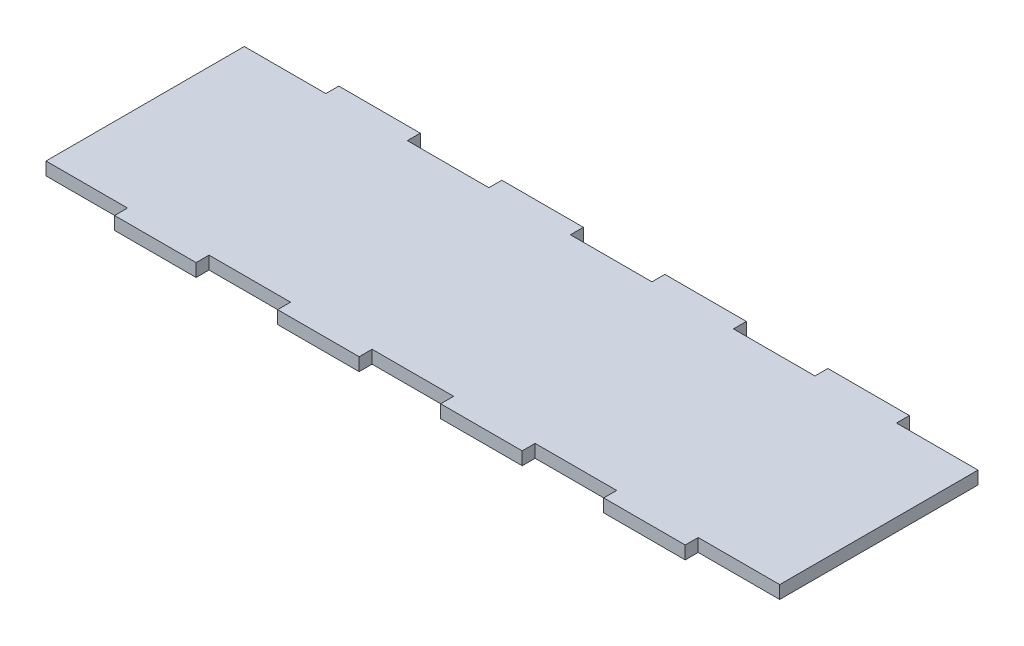
ISO-10303-21;
HEADER;
FILE_DESCRIPTION(('STEP AP214'),'2;1');
FILE_NAME('part.step','',(''),(''),'','','');
FILE_SCHEMA(('AUTOMOTIVE_DESIGN { 1 0 10303 214 1 1 1 1 }'));
ENDSEC;
DATA;
#1=APPLICATION_CONTEXT('core data for automotive mechanical design processes');
#2=APPLICATION_PROTOCOL_DEFINITION('international standard','automotive_design',2000,#1);
#3=PRODUCT_CONTEXT('',#1,'mechanical');
#4=PRODUCT('Part','Part','',(#3));
#5=PRODUCT_RELATED_PRODUCT_CATEGORY('part','',(#4));
#6=PRODUCT_DEFINITION_FORMATION('','',#4);
#7=PRODUCT_DEFINITION_CONTEXT('part definition',#1,'design');
#8=PRODUCT_DEFINITION('design','',#6,#7);
#9=PRODUCT_DEFINITION_SHAPE('','',#8);
#10=(LENGTH_UNIT() NAMED_UNIT(*) SI_UNIT(.MILLI.,.METRE.));
#11=(NAMED_UNIT(*) PLANE_ANGLE_UNIT() SI_UNIT($,.RADIAN.));
#12=(NAMED_UNIT(*) SI_UNIT($,.STERADIAN.) SOLID_ANGLE_UNIT());
#13=UNCERTAINTY_MEASURE_WITH_UNIT(LENGTH_MEASURE(1.E-05),#10,'distance_accuracy_value','');
#14=(GEOMETRIC_REPRESENTATION_CONTEXT(3) GLOBAL_UNCERTAINTY_ASSIGNED_CONTEXT((#13)) GLOBAL_UNIT_ASSIGNED_CONTEXT((#10,
#11,#12)) REPRESENTATION_CONTEXT('',''));
#15=CARTESIAN_POINT('',(0.,0.,0.));
#16=DIRECTION('',(0.,0.,1.));
#17=DIRECTION('',(1.,0.,0.));
#18=AXIS2_PLACEMENT_3D('',#15,#16,#17);
#19=CARTESIAN_POINT('',(1.11022302462516E-13,3.175,48.65));
#20=DIRECTION('',(1.,0.,0.));
#21=DIRECTION('',(0.,0.,-1.));
#22=AXIS2_PLACEMENT_3D('',#19,#20,#21);
#23=PLANE('',#22);
#24=DIRECTION('',(0.,0.,1.));
#25=VECTOR('',#24,1.);
#26=CARTESIAN_POINT('',(1.11022302462516E-13,0.,48.65));
#27=LINE('',#26,#25);
#28=CARTESIAN_POINT('',(0.,0.,0.));
#29=VERTEX_POINT('',#28);
#30=CARTESIAN_POINT('',(1.11022302462516E-13,0.,48.65));
#31=VERTEX_POINT('',#30);
#32=EDGE_CURVE('E297',#29,#31,#27,.T.);
#33=ORIENTED_EDGE('',*,*,#32,.T.);
#34=DIRECTION('',(0.,-1.,0.));
#35=VECTOR('',#34,1.);
#36=CARTESIAN_POINT('',(1.11022302462516E-13,3.175,48.65));
#37=LINE('',#36,#35);
#38=CARTESIAN_POINT('',(1.11022302462516E-13,3.175,48.65));
#39=VERTEX_POINT('',#38);
#40=EDGE_CURVE('E11',#39,#31,#37,.T.);
#41=ORIENTED_EDGE('',*,*,#40,.F.);
#42=DIRECTION('',(0.,0.,1.));
#43=VECTOR('',#42,1.);
#44=CARTESIAN_POINT('',(1.11022302462516E-13,3.175,48.65));
#45=LINE('',#44,#43);
#46=CARTESIAN_POINT('',(0.,3.175,0.));
#47=VERTEX_POINT('',#46);
#48=EDGE_CURVE('E367',#47,#39,#45,.T.);
#49=ORIENTED_EDGE('',*,*,#48,.F.);
#50=DIRECTION('',(0.,-1.,0.));
#51=VECTOR('',#50,1.);
#52=CARTESIAN_POINT('',(0.,3.175,0.));
#53=LINE('',#52,#51);
#54=EDGE_CURVE('E293',#47,#29,#53,.T.);
#55=ORIENTED_EDGE('',*,*,#54,.T.);
#56=EDGE_LOOP('',(#33,#41,#49,#55));
#57=FACE_BOUND('',#56,.T.);
#58=ADVANCED_FACE('F33',(#57),#23,.F.);
#59=CARTESIAN_POINT('',(1.11022302462516E-13,3.175,48.65));
#60=DIRECTION('',(0.,0.,-1.));
#61=DIRECTION('',(-1.,0.,0.));
#62=AXIS2_PLACEMENT_3D('',#59,#60,#61);
#63=PLANE('',#62);
#64=DIRECTION('',(1.,0.,0.));
#65=VECTOR('',#64,1.);
#66=CARTESIAN_POINT('',(1.11022302462516E-13,0.,48.65));
#67=LINE('',#66,#65);
#68=CARTESIAN_POINT('',(20.0000000000001,0.,48.65));
#69=VERTEX_POINT('',#68);
#70=EDGE_CURVE('E300',#31,#69,#67,.T.);
#71=ORIENTED_EDGE('',*,*,#70,.T.);
#72=DIRECTION('',(0.,-1.,0.));
#73=VECTOR('',#72,1.);
#74=CARTESIAN_POINT('',(20.0000000000001,3.175,48.65));
#75=LINE('',#74,#73);
#76=CARTESIAN_POINT('',(20.0000000000001,3.175,48.65));
#77=VERTEX_POINT('',#76);
#78=EDGE_CURVE('E41',#77,#69,#75,.T.);
#79=ORIENTED_EDGE('',*,*,#78,.F.);
#80=DIRECTION('',(1.,0.,0.));
#81=VECTOR('',#80,1.);
#82=CARTESIAN_POINT('',(1.11022302462516E-13,3.175,48.65));
#83=LINE('',#82,#81);
#84=EDGE_CURVE('E176',#39,#77,#83,.T.);
#85=ORIENTED_EDGE('',*,*,#84,.F.);
#86=ORIENTED_EDGE('',*,*,#40,.T.);
#87=EDGE_LOOP('',(#71,#79,#85,#86));
#88=FACE_BOUND('',#87,.T.);
#89=ADVANCED_FACE('F565',(#88),#63,.F.);
#90=CARTESIAN_POINT('',(20.0000000000001,3.175,48.65));
#91=DIRECTION('',(1.,0.,0.));
#92=DIRECTION('',(0.,0.,-1.));
#93=AXIS2_PLACEMENT_3D('',#90,#91,#92);
#94=PLANE('',#93);
#95=DIRECTION('',(0.,0.,1.));
#96=VECTOR('',#95,1.);
#97=CARTESIAN_POINT('',(20.0000000000001,0.,48.65));
#98=LINE('',#97,#96);
#99=CARTESIAN_POINT('',(20.0000000000001,0.,51.825));
#100=VERTEX_POINT('',#99);
#101=EDGE_CURVE('E302',#69,#100,#98,.T.);
#102=ORIENTED_EDGE('',*,*,#101,.T.);
#103=DIRECTION('',(0.,-1.,0.));
#104=VECTOR('',#103,1.);
#105=CARTESIAN_POINT('',(20.0000000000001,3.175,51.825));
#106=LINE('',#105,#104);
#107=CARTESIAN_POINT('',(20.0000000000001,3.175,51.825));
#108=VERTEX_POINT('',#107);
#109=EDGE_CURVE('E458',#108,#100,#106,.T.);
#110=ORIENTED_EDGE('',*,*,#109,.F.);
#111=DIRECTION('',(0.,0.,1.));
#112=VECTOR('',#111,1.);
#113=CARTESIAN_POINT('',(20.0000000000001,3.175,48.65));
#114=LINE('',#113,#112);
#115=EDGE_CURVE('E466',#77,#108,#114,.T.);
#116=ORIENTED_EDGE('',*,*,#115,.F.);
#117=ORIENTED_EDGE('',*,*,#78,.T.);
#118=EDGE_LOOP('',(#102,#110,#116,#117));
#119=FACE_BOUND('',#118,.T.);
#120=ADVANCED_FACE('F464',(#119),#94,.F.);
#121=CARTESIAN_POINT('',(20.0000000000001,3.175,51.825));
#122=DIRECTION('',(0.,0.,-1.));
#123=DIRECTION('',(-1.,0.,0.));
#124=AXIS2_PLACEMENT_3D('',#121,#122,#123);
#125=PLANE('',#124);
#126=DIRECTION('',(1.,0.,0.));
#127=VECTOR('',#126,1.);
#128=CARTESIAN_POINT('',(20.0000000000001,0.,51.825));
#129=LINE('',#128,#127);
#130=CARTESIAN_POINT('',(40.0000000000001,0.,51.825));
#131=VERTEX_POINT('',#130);
#132=EDGE_CURVE('E304',#100,#131,#129,.T.);
#133=ORIENTED_EDGE('',*,*,#132,.T.);
#134=DIRECTION('',(0.,-1.,0.));
#135=VECTOR('',#134,1.);
#136=CARTESIAN_POINT('',(40.0000000000001,3.175,51.825));
#137=LINE('',#136,#135);
#138=CARTESIAN_POINT('',(40.0000000000001,3.175,51.825));
#139=VERTEX_POINT('',#138);
#140=EDGE_CURVE('E455',#139,#131,#137,.T.);
#141=ORIENTED_EDGE('',*,*,#140,.F.);
#142=DIRECTION('',(1.,0.,0.));
#143=VECTOR('',#142,1.);
#144=CARTESIAN_POINT('',(20.0000000000001,3.175,51.825));
#145=LINE('',#144,#143);
#146=EDGE_CURVE('E484',#108,#139,#145,.T.);
#147=ORIENTED_EDGE('',*,*,#146,.F.);
#148=ORIENTED_EDGE('',*,*,#109,.T.);
#149=EDGE_LOOP('',(#133,#141,#147,#148));
#150=FACE_BOUND('',#149,.T.);
#151=ADVANCED_FACE('F475',(#150),#125,.F.);
#152=CARTESIAN_POINT('',(40.0000000000001,3.175,51.825));
#153=DIRECTION('',(-1.,0.,0.));
#154=DIRECTION('',(0.,0.,1.));
#155=AXIS2_PLACEMENT_3D('',#152,#153,#154);
#156=PLANE('',#155);
#157=DIRECTION('',(0.,0.,-1.));
#158=VECTOR('',#157,1.);
#159=CARTESIAN_POINT('',(40.0000000000001,0.,51.825));
#160=LINE('',#159,#158);
#161=CARTESIAN_POINT('',(40.0000000000001,0.,48.65));
#162=VERTEX_POINT('',#161);
#163=EDGE_CURVE('E306',#131,#162,#160,.T.);
#164=ORIENTED_EDGE('',*,*,#163,.T.);
#165=DIRECTION('',(0.,-1.,0.));
#166=VECTOR('',#165,1.);
#167=CARTESIAN_POINT('',(40.0000000000001,3.175,48.65));
#168=LINE('',#167,#166);
#169=CARTESIAN_POINT('',(40.0000000000001,3.175,48.65));
#170=VERTEX_POINT('',#169);
#171=EDGE_CURVE('E452',#170,#162,#168,.T.);
#172=ORIENTED_EDGE('',*,*,#171,.F.);
#173=DIRECTION('',(0.,0.,-1.));
#174=VECTOR('',#173,1.);
#175=CARTESIAN_POINT('',(40.0000000000001,3.175,51.825));
#176=LINE('',#175,#174);
#177=EDGE_CURVE('E481',#139,#170,#176,.T.);
#178=ORIENTED_EDGE('',*,*,#177,.F.);
#179=ORIENTED_EDGE('',*,*,#140,.T.);
#180=EDGE_LOOP('',(#164,#172,#178,#179));
#181=FACE_BOUND('',#180,.T.);
#182=ADVANCED_FACE('F479',(#181),#156,.F.);
#183=CARTESIAN_POINT('',(40.0000000000001,3.175,48.65));
#184=DIRECTION('',(0.,0.,-1.));
#185=DIRECTION('',(-1.,0.,0.));
#186=AXIS2_PLACEMENT_3D('',#183,#184,#185);
#187=PLANE('',#186);
#188=DIRECTION('',(1.,0.,0.));
#189=VECTOR('',#188,1.);
#190=CARTESIAN_POINT('',(40.0000000000001,0.,48.65));
#191=LINE('',#190,#189);
#192=CARTESIAN_POINT('',(60.0000000000001,0.,48.65));
#193=VERTEX_POINT('',#192);
#194=EDGE_CURVE('E308',#162,#193,#191,.T.);
#195=ORIENTED_EDGE('',*,*,#194,.T.);
#196=DIRECTION('',(0.,-1.,0.));
#197=VECTOR('',#196,1.);
#198=CARTESIAN_POINT('',(60.0000000000001,3.175,48.65));
#199=LINE('',#198,#197);
#200=CARTESIAN_POINT('',(60.0000000000001,3.175,48.65));
#201=VERTEX_POINT('',#200);
#202=EDGE_CURVE('E449',#201,#193,#199,.T.);
#203=ORIENTED_EDGE('',*,*,#202,.F.);
#204=DIRECTION('',(1.,0.,0.));
#205=VECTOR('',#204,1.);
#206=CARTESIAN_POINT('',(40.0000000000001,3.175,48.65));
#207=LINE('',#206,#205);
#208=EDGE_CURVE('E483',#170,#201,#207,.T.);
#209=ORIENTED_EDGE('',*,*,#208,.F.);
#210=ORIENTED_EDGE('',*,*,#171,.T.);
#211=EDGE_LOOP('',(#195,#203,#209,#210));
#212=FACE_BOUND('',#211,.T.);
#213=ADVANCED_FACE('F578',(#212),#187,.F.);
#214=CARTESIAN_POINT('',(60.0000000000001,3.175,48.65));
#215=DIRECTION('',(1.,0.,0.));
#216=DIRECTION('',(0.,0.,-1.));
#217=AXIS2_PLACEMENT_3D('',#214,#215,#216);
#218=PLANE('',#217);
#219=DIRECTION('',(0.,0.,1.));
#220=VECTOR('',#219,1.);
#221=CARTESIAN_POINT('',(60.0000000000001,0.,48.65));
#222=LINE('',#221,#220);
#223=CARTESIAN_POINT('',(60.0000000000001,0.,51.825));
#224=VERTEX_POINT('',#223);
#225=EDGE_CURVE('E310',#193,#224,#222,.T.);
#226=ORIENTED_EDGE('',*,*,#225,.T.);
#227=DIRECTION('',(0.,-1.,0.));
#228=VECTOR('',#227,1.);
#229=CARTESIAN_POINT('',(60.0000000000001,3.175,51.825));
#230=LINE('',#229,#228);
#231=CARTESIAN_POINT('',(60.0000000000001,3.175,51.825));
#232=VERTEX_POINT('',#231);
#233=EDGE_CURVE('E446',#232,#224,#230,.T.);
#234=ORIENTED_EDGE('',*,*,#233,.F.);
#235=DIRECTION('',(0.,0.,1.));
#236=VECTOR('',#235,1.);
#237=CARTESIAN_POINT('',(60.0000000000001,3.175,48.65));
#238=LINE('',#237,#236);
#239=EDGE_CURVE('E486',#201,#232,#238,.T.);
#240=ORIENTED_EDGE('',*,*,#239,.F.);
#241=ORIENTED_EDGE('',*,*,#202,.T.);
#242=EDGE_LOOP('',(#226,#234,#240,#241));
#243=FACE_BOUND('',#242,.T.);
#244=ADVANCED_FACE('F581',(#243),#218,.F.);
#245=CARTESIAN_POINT('',(60.0000000000001,3.175,51.825));
#246=DIRECTION('',(0.,0.,-1.));
#247=DIRECTION('',(-1.,0.,0.));
#248=AXIS2_PLACEMENT_3D('',#245,#246,#247);
#249=PLANE('',#248);
#250=DIRECTION('',(1.,0.,0.));
#251=VECTOR('',#250,1.);
#252=CARTESIAN_POINT('',(60.0000000000001,0.,51.825));
#253=LINE('',#252,#251);
#254=CARTESIAN_POINT('',(80.0000000000001,0.,51.825));
#255=VERTEX_POINT('',#254);
#256=EDGE_CURVE('E312',#224,#255,#253,.T.);
#257=ORIENTED_EDGE('',*,*,#256,.T.);
#258=DIRECTION('',(0.,-1.,0.));
#259=VECTOR('',#258,1.);
#260=CARTESIAN_POINT('',(80.0000000000001,3.175,51.825));
#261=LINE('',#260,#259);
#262=CARTESIAN_POINT('',(80.0000000000001,3.175,51.825));
#263=VERTEX_POINT('',#262);
#264=EDGE_CURVE('E443',#263,#255,#261,.T.);
#265=ORIENTED_EDGE('',*,*,#264,.F.);
#266=DIRECTION('',(1.,0.,0.));
#267=VECTOR('',#266,1.);
#268=CARTESIAN_POINT('',(60.0000000000001,3.175,51.825));
#269=LINE('',#268,#267);
#270=EDGE_CURVE('E492',#232,#263,#269,.T.);
#271=ORIENTED_EDGE('',*,*,#270,.F.);
#272=ORIENTED_EDGE('',*,*,#233,.T.);
#273=EDGE_LOOP('',(#257,#265,#271,#272));
#274=FACE_BOUND('',#273,.T.);
#275=ADVANCED_FACE('F585',(#274),#249,.F.);
#276=CARTESIAN_POINT('',(80.0000000000001,3.175,51.825));
#277=DIRECTION('',(-1.,0.,0.));
#278=DIRECTION('',(0.,0.,1.));
#279=AXIS2_PLACEMENT_3D('',#276,#277,#278);
#280=PLANE('',#279);
#281=DIRECTION('',(0.,0.,-1.));
#282=VECTOR('',#281,1.);
#283=CARTESIAN_POINT('',(80.0000000000001,0.,51.825));
#284=LINE('',#283,#282);
#285=CARTESIAN_POINT('',(80.0000000000001,0.,48.65));
#286=VERTEX_POINT('',#285);
#287=EDGE_CURVE('E314',#255,#286,#284,.T.);
#288=ORIENTED_EDGE('',*,*,#287,.T.);
#289=DIRECTION('',(0.,-1.,0.));
#290=VECTOR('',#289,1.);
#291=CARTESIAN_POINT('',(80.0000000000001,3.175,48.65));
#292=LINE('',#291,#290);
#293=CARTESIAN_POINT('',(80.0000000000001,3.175,48.65));
#294=VERTEX_POINT('',#293);
#295=EDGE_CURVE('E440',#294,#286,#292,.T.);
#296=ORIENTED_EDGE('',*,*,#295,.F.);
#297=DIRECTION('',(0.,0.,-1.));
#298=VECTOR('',#297,1.);
#299=CARTESIAN_POINT('',(80.0000000000001,3.175,51.825));
#300=LINE('',#299,#298);
#301=EDGE_CURVE('E494',#263,#294,#300,.T.);
#302=ORIENTED_EDGE('',*,*,#301,.F.);
#303=ORIENTED_EDGE('',*,*,#264,.T.);
#304=EDGE_LOOP('',(#288,#296,#302,#303));
#305=FACE_BOUND('',#304,.T.);
#306=ADVANCED_FACE('F589',(#305),#280,.F.);
#307=CARTESIAN_POINT('',(80.0000000000001,3.175,48.65));
#308=DIRECTION('',(0.,0.,-1.));
#309=DIRECTION('',(-1.,0.,0.));
#310=AXIS2_PLACEMENT_3D('',#307,#308,#309);
#311=PLANE('',#310);
#312=DIRECTION('',(1.,0.,0.));
#313=VECTOR('',#312,1.);
#314=CARTESIAN_POINT('',(80.0000000000001,0.,48.65));
#315=LINE('',#314,#313);
#316=CARTESIAN_POINT('',(100.,0.,48.65));
#317=VERTEX_POINT('',#316);
#318=EDGE_CURVE('E316',#286,#317,#315,.T.);
#319=ORIENTED_EDGE('',*,*,#318,.T.);
#320=DIRECTION('',(0.,-1.,0.));
#321=VECTOR('',#320,1.);
#322=CARTESIAN_POINT('',(100.,3.175,48.65));
#323=LINE('',#322,#321);
#324=CARTESIAN_POINT('',(100.,3.175,48.65));
#325=VERTEX_POINT('',#324);
#326=EDGE_CURVE('E437',#325,#317,#323,.T.);
#327=ORIENTED_EDGE('',*,*,#326,.F.);
#328=DIRECTION('',(1.,0.,0.));
#329=VECTOR('',#328,1.);
#330=CARTESIAN_POINT('',(80.0000000000001,3.175,48.65));
#331=LINE('',#330,#329);
#332=EDGE_CURVE('E496',#294,#325,#331,.T.);
#333=ORIENTED_EDGE('',*,*,#332,.F.);
#334=ORIENTED_EDGE('',*,*,#295,.T.);
#335=EDGE_LOOP('',(#319,#327,#333,#334));
#336=FACE_BOUND('',#335,.T.);
#337=ADVANCED_FACE('F593',(#336),#311,.F.);
#338=CARTESIAN_POINT('',(100.,3.175,48.65));
#339=DIRECTION('',(1.,0.,0.));
#340=DIRECTION('',(0.,0.,-1.));
#341=AXIS2_PLACEMENT_3D('',#338,#339,#340);
#342=PLANE('',#341);
#343=DIRECTION('',(0.,0.,1.));
#344=VECTOR('',#343,1.);
#345=CARTESIAN_POINT('',(100.,0.,48.65));
#346=LINE('',#345,#344);
#347=CARTESIAN_POINT('',(100.,0.,51.825));
#348=VERTEX_POINT('',#347);
#349=EDGE_CURVE('E318',#317,#348,#346,.T.);
#350=ORIENTED_EDGE('',*,*,#349,.T.);
#351=DIRECTION('',(0.,-1.,0.));
#352=VECTOR('',#351,1.);
#353=CARTESIAN_POINT('',(100.,3.175,51.825));
#354=LINE('',#353,#352);
#355=CARTESIAN_POINT('',(100.,3.175,51.825));
#356=VERTEX_POINT('',#355);
#357=EDGE_CURVE('E434',#356,#348,#354,.T.);
#358=ORIENTED_EDGE('',*,*,#357,.F.);
#359=DIRECTION('',(0.,0.,1.));
#360=VECTOR('',#359,1.);
#361=CARTESIAN_POINT('',(100.,3.175,48.65));
#362=LINE('',#361,#360);
#363=EDGE_CURVE('E498',#325,#356,#362,.T.);
#364=ORIENTED_EDGE('',*,*,#363,.F.);
#365=ORIENTED_EDGE('',*,*,#326,.T.);
#366=EDGE_LOOP('',(#350,#358,#364,#365));
#367=FACE_BOUND('',#366,.T.);
#368=ADVANCED_FACE('F597',(#367),#342,.F.);
#369=CARTESIAN_POINT('',(100.,3.175,51.825));
#370=DIRECTION('',(0.,0.,-1.));
#371=DIRECTION('',(-1.,0.,0.));
#372=AXIS2_PLACEMENT_3D('',#369,#370,#371);
#373=PLANE('',#372);
#374=DIRECTION('',(1.,0.,0.));
#375=VECTOR('',#374,1.);
#376=CARTESIAN_POINT('',(100.,0.,51.825));
#377=LINE('',#376,#375);
#378=CARTESIAN_POINT('',(120.,0.,51.825));
#379=VERTEX_POINT('',#378);
#380=EDGE_CURVE('E320',#348,#379,#377,.T.);
#381=ORIENTED_EDGE('',*,*,#380,.T.);
#382=DIRECTION('',(0.,-1.,0.));
#383=VECTOR('',#382,1.);
#384=CARTESIAN_POINT('',(120.,3.175,51.825));
#385=LINE('',#384,#383);
#386=CARTESIAN_POINT('',(120.,3.175,51.825));
#387=VERTEX_POINT('',#386);
#388=EDGE_CURVE('E431',#387,#379,#385,.T.);
#389=ORIENTED_EDGE('',*,*,#388,.F.);
#390=DIRECTION('',(1.,0.,0.));
#391=VECTOR('',#390,1.);
#392=CARTESIAN_POINT('',(100.,3.175,51.825));
#393=LINE('',#392,#391);
#394=EDGE_CURVE('E500',#356,#387,#393,.T.);
#395=ORIENTED_EDGE('',*,*,#394,.F.);
#396=ORIENTED_EDGE('',*,*,#357,.T.);
#397=EDGE_LOOP('',(#381,#389,#395,#396));
#398=FACE_BOUND('',#397,.T.);
#399=ADVANCED_FACE('F601',(#398),#373,.F.);
#400=CARTESIAN_POINT('',(120.,3.175,51.825));
#401=DIRECTION('',(-1.,0.,0.));
#402=DIRECTION('',(0.,0.,1.));
#403=AXIS2_PLACEMENT_3D('',#400,#401,#402);
#404=PLANE('',#403);
#405=DIRECTION('',(0.,0.,-1.));
#406=VECTOR('',#405,1.);
#407=CARTESIAN_POINT('',(120.,0.,51.825));
#408=LINE('',#407,#406);
#409=CARTESIAN_POINT('',(120.,0.,48.65));
#410=VERTEX_POINT('',#409);
#411=EDGE_CURVE('E322',#379,#410,#408,.T.);
#412=ORIENTED_EDGE('',*,*,#411,.T.);
#413=DIRECTION('',(0.,-1.,0.));
#414=VECTOR('',#413,1.);
#415=CARTESIAN_POINT('',(120.,3.175,48.65));
#416=LINE('',#415,#414);
#417=CARTESIAN_POINT('',(120.,3.175,48.65));
#418=VERTEX_POINT('',#417);
#419=EDGE_CURVE('E428',#418,#410,#416,.T.);
#420=ORIENTED_EDGE('',*,*,#419,.F.);
#421=DIRECTION('',(0.,0.,-1.));
#422=VECTOR('',#421,1.);
#423=CARTESIAN_POINT('',(120.,3.175,51.825));
#424=LINE('',#423,#422);
#425=EDGE_CURVE('E502',#387,#418,#424,.T.);
#426=ORIENTED_EDGE('',*,*,#425,.F.);
#427=ORIENTED_EDGE('',*,*,#388,.T.);
#428=EDGE_LOOP('',(#412,#420,#426,#427));
#429=FACE_BOUND('',#428,.T.);
#430=ADVANCED_FACE('F605',(#429),#404,.F.);
#431=CARTESIAN_POINT('',(120.,3.175,48.65));
#432=DIRECTION('',(0.,0.,-1.));
#433=DIRECTION('',(-1.,0.,0.));
#434=AXIS2_PLACEMENT_3D('',#431,#432,#433);
#435=PLANE('',#434);
#436=DIRECTION('',(1.,0.,0.));
#437=VECTOR('',#436,1.);
#438=CARTESIAN_POINT('',(120.,0.,48.65));
#439=LINE('',#438,#437);
#440=CARTESIAN_POINT('',(140.,0.,48.65));
#441=VERTEX_POINT('',#440);
#442=EDGE_CURVE('E324',#410,#441,#439,.T.);
#443=ORIENTED_EDGE('',*,*,#442,.T.);
#444=DIRECTION('',(0.,-1.,0.));
#445=VECTOR('',#444,1.);
#446=CARTESIAN_POINT('',(140.,3.175,48.65));
#447=LINE('',#446,#445);
#448=CARTESIAN_POINT('',(140.,3.175,48.65));
#449=VERTEX_POINT('',#448);
#450=EDGE_CURVE('E425',#449,#441,#447,.T.);
#451=ORIENTED_EDGE('',*,*,#450,.F.);
#452=DIRECTION('',(1.,0.,0.));
#453=VECTOR('',#452,1.);
#454=CARTESIAN_POINT('',(120.,3.175,48.65));
#455=LINE('',#454,#453);
#456=EDGE_CURVE('E504',#418,#449,#455,.T.);
#457=ORIENTED_EDGE('',*,*,#456,.F.);
#458=ORIENTED_EDGE('',*,*,#419,.T.);
#459=EDGE_LOOP('',(#443,#451,#457,#458));
#460=FACE_BOUND('',#459,.T.);
#461=ADVANCED_FACE('F609',(#460),#435,.F.);
#462=CARTESIAN_POINT('',(140.,3.175,48.65));
#463=DIRECTION('',(1.,0.,0.));
#464=DIRECTION('',(0.,0.,-1.));
#465=AXIS2_PLACEMENT_3D('',#462,#463,#464);
#466=PLANE('',#465);
#467=DIRECTION('',(0.,0.,1.));
#468=VECTOR('',#467,1.);
#469=CARTESIAN_POINT('',(140.,0.,48.65));
#470=LINE('',#469,#468);
#471=CARTESIAN_POINT('',(140.,0.,51.825));
#472=VERTEX_POINT('',#471);
#473=EDGE_CURVE('E326',#441,#472,#470,.T.);
#474=ORIENTED_EDGE('',*,*,#473,.T.);
#475=DIRECTION('',(0.,-1.,0.));
#476=VECTOR('',#475,1.);
#477=CARTESIAN_POINT('',(140.,3.175,51.825));
#478=LINE('',#477,#476);
#479=CARTESIAN_POINT('',(140.,3.175,51.825));
#480=VERTEX_POINT('',#479);
#481=EDGE_CURVE('E422',#480,#472,#478,.T.);
#482=ORIENTED_EDGE('',*,*,#481,.F.);
#483=DIRECTION('',(0.,0.,1.));
#484=VECTOR('',#483,1.);
#485=CARTESIAN_POINT('',(140.,3.175,48.65));
#486=LINE('',#485,#484);
#487=EDGE_CURVE('E506',#449,#480,#486,.T.);
#488=ORIENTED_EDGE('',*,*,#487,.F.);
#489=ORIENTED_EDGE('',*,*,#450,.T.);
#490=EDGE_LOOP('',(#474,#482,#488,#489));
#491=FACE_BOUND('',#490,.T.);
#492=ADVANCED_FACE('F613',(#491),#466,.F.);
#493=CARTESIAN_POINT('',(140.,3.175,51.825));
#494=DIRECTION('',(0.,0.,-1.));
#495=DIRECTION('',(-1.,0.,0.));
#496=AXIS2_PLACEMENT_3D('',#493,#494,#495);
#497=PLANE('',#496);
#498=DIRECTION('',(1.,0.,0.));
#499=VECTOR('',#498,1.);
#500=CARTESIAN_POINT('',(140.,0.,51.825));
#501=LINE('',#500,#499);
#502=CARTESIAN_POINT('',(160.,0.,51.825));
#503=VERTEX_POINT('',#502);
#504=EDGE_CURVE('E328',#472,#503,#501,.T.);
#505=ORIENTED_EDGE('',*,*,#504,.T.);
#506=DIRECTION('',(0.,-1.,0.));
#507=VECTOR('',#506,1.);
#508=CARTESIAN_POINT('',(160.,3.175,51.825));
#509=LINE('',#508,#507);
#510=CARTESIAN_POINT('',(160.,3.175,51.825));
#511=VERTEX_POINT('',#510);
#512=EDGE_CURVE('E419',#511,#503,#509,.T.);
#513=ORIENTED_EDGE('',*,*,#512,.F.);
#514=DIRECTION('',(1.,0.,0.));
#515=VECTOR('',#514,1.);
#516=CARTESIAN_POINT('',(140.,3.175,51.825));
#517=LINE('',#516,#515);
#518=EDGE_CURVE('E508',#480,#511,#517,.T.);
#519=ORIENTED_EDGE('',*,*,#518,.F.);
#520=ORIENTED_EDGE('',*,*,#481,.T.);
#521=EDGE_LOOP('',(#505,#513,#519,#520));
#522=FACE_BOUND('',#521,.T.);
#523=ADVANCED_FACE('F617',(#522),#497,.F.);
#524=CARTESIAN_POINT('',(160.,3.175,51.825));
#525=DIRECTION('',(-1.,0.,0.));
#526=DIRECTION('',(0.,0.,1.));
#527=AXIS2_PLACEMENT_3D('',#524,#525,#526);
#528=PLANE('',#527);
#529=DIRECTION('',(0.,0.,-1.));
#530=VECTOR('',#529,1.);
#531=CARTESIAN_POINT('',(160.,0.,51.825));
#532=LINE('',#531,#530);
#533=CARTESIAN_POINT('',(160.,0.,48.65));
#534=VERTEX_POINT('',#533);
#535=EDGE_CURVE('E330',#503,#534,#532,.T.);
#536=ORIENTED_EDGE('',*,*,#535,.T.);
#537=DIRECTION('',(0.,-1.,0.));
#538=VECTOR('',#537,1.);
#539=CARTESIAN_POINT('',(160.,3.175,48.65));
#540=LINE('',#539,#538);
#541=CARTESIAN_POINT('',(160.,3.175,48.65));
#542=VERTEX_POINT('',#541);
#543=EDGE_CURVE('E416',#542,#534,#540,.T.);
#544=ORIENTED_EDGE('',*,*,#543,.F.);
#545=DIRECTION('',(0.,0.,-1.));
#546=VECTOR('',#545,1.);
#547=CARTESIAN_POINT('',(160.,3.175,51.825));
#548=LINE('',#547,#546);
#549=EDGE_CURVE('E510',#511,#542,#548,.T.);
#550=ORIENTED_EDGE('',*,*,#549,.F.);
#551=ORIENTED_EDGE('',*,*,#512,.T.);
#552=EDGE_LOOP('',(#536,#544,#550,#551));
#553=FACE_BOUND('',#552,.T.);
#554=ADVANCED_FACE('F621',(#553),#528,.F.);
#555=CARTESIAN_POINT('',(160.,3.175,48.65));
#556=DIRECTION('',(0.,0.,-1.));
#557=DIRECTION('',(-1.,0.,0.));
#558=AXIS2_PLACEMENT_3D('',#555,#556,#557);
#559=PLANE('',#558);
#560=DIRECTION('',(1.,0.,0.));
#561=VECTOR('',#560,1.);
#562=CARTESIAN_POINT('',(160.,0.,48.65));
#563=LINE('',#562,#561);
#564=CARTESIAN_POINT('',(180.,0.,48.65));
#565=VERTEX_POINT('',#564);
#566=EDGE_CURVE('E332',#534,#565,#563,.T.);
#567=ORIENTED_EDGE('',*,*,#566,.T.);
#568=DIRECTION('',(0.,-1.,0.));
#569=VECTOR('',#568,1.);
#570=CARTESIAN_POINT('',(180.,3.175,48.65));
#571=LINE('',#570,#569);
#572=CARTESIAN_POINT('',(180.,3.175,48.65));
#573=VERTEX_POINT('',#572);
#574=EDGE_CURVE('E413',#573,#565,#571,.T.);
#575=ORIENTED_EDGE('',*,*,#574,.F.);
#576=DIRECTION('',(1.,0.,0.));
#577=VECTOR('',#576,1.);
#578=CARTESIAN_POINT('',(160.,3.175,48.65));
#579=LINE('',#578,#577);
#580=EDGE_CURVE('E512',#542,#573,#579,.T.);
#581=ORIENTED_EDGE('',*,*,#580,.F.);
#582=ORIENTED_EDGE('',*,*,#543,.T.);
#583=EDGE_LOOP('',(#567,#575,#581,#582));
#584=FACE_BOUND('',#583,.T.);
#585=ADVANCED_FACE('F625',(#584),#559,.F.);
#586=CARTESIAN_POINT('',(180.,3.175,0.));
#587=DIRECTION('',(-1.,0.,0.));
#588=DIRECTION('',(0.,0.,1.));
#589=AXIS2_PLACEMENT_3D('',#586,#587,#588);
#590=PLANE('',#589);
#591=DIRECTION('',(0.,0.,-1.));
#592=VECTOR('',#591,1.);
#593=CARTESIAN_POINT('',(180.,0.,0.));
#594=LINE('',#593,#592);
#595=CARTESIAN_POINT('',(180.,0.,0.));
#596=VERTEX_POINT('',#595);
#597=EDGE_CURVE('E334',#565,#596,#594,.T.);
#598=ORIENTED_EDGE('',*,*,#597,.T.);
#599=DIRECTION('',(0.,-1.,0.));
#600=VECTOR('',#599,1.);
#601=CARTESIAN_POINT('',(180.,3.175,0.));
#602=LINE('',#601,#600);
#603=CARTESIAN_POINT('',(180.,3.175,0.));
#604=VERTEX_POINT('',#603);
#605=EDGE_CURVE('E410',#604,#596,#602,.T.);
#606=ORIENTED_EDGE('',*,*,#605,.F.);
#607=DIRECTION('',(0.,0.,-1.));
#608=VECTOR('',#607,1.);
#609=CARTESIAN_POINT('',(180.,3.175,0.));
#610=LINE('',#609,#608);
#611=EDGE_CURVE('E514',#573,#604,#610,.T.);
#612=ORIENTED_EDGE('',*,*,#611,.F.);
#613=ORIENTED_EDGE('',*,*,#574,.T.);
#614=EDGE_LOOP('',(#598,#606,#612,#613));
#615=FACE_BOUND('',#614,.T.);
#616=ADVANCED_FACE('F629',(#615),#590,.F.);
#617=CARTESIAN_POINT('',(160.,3.175,0.));
#618=DIRECTION('',(0.,0.,1.));
#619=DIRECTION('',(1.,0.,0.));
#620=AXIS2_PLACEMENT_3D('',#617,#618,#619);
#621=PLANE('',#620);
#622=DIRECTION('',(-1.,0.,0.));
#623=VECTOR('',#622,1.);
#624=CARTESIAN_POINT('',(160.,0.,0.));
#625=LINE('',#624,#623);
#626=CARTESIAN_POINT('',(160.,0.,0.));
#627=VERTEX_POINT('',#626);
#628=EDGE_CURVE('E336',#596,#627,#625,.T.);
#629=ORIENTED_EDGE('',*,*,#628,.T.);
#630=DIRECTION('',(0.,-1.,0.));
#631=VECTOR('',#630,1.);
#632=CARTESIAN_POINT('',(160.,3.175,0.));
#633=LINE('',#632,#631);
#634=CARTESIAN_POINT('',(160.,3.175,0.));
#635=VERTEX_POINT('',#634);
#636=EDGE_CURVE('E407',#635,#627,#633,.T.);
#637=ORIENTED_EDGE('',*,*,#636,.F.);
#638=DIRECTION('',(-1.,0.,0.));
#639=VECTOR('',#638,1.);
#640=CARTESIAN_POINT('',(160.,3.175,0.));
#641=LINE('',#640,#639);
#642=EDGE_CURVE('E516',#604,#635,#641,.T.);
#643=ORIENTED_EDGE('',*,*,#642,.F.);
#644=ORIENTED_EDGE('',*,*,#605,.T.);
#645=EDGE_LOOP('',(#629,#637,#643,#644));
#646=FACE_BOUND('',#645,.T.);
#647=ADVANCED_FACE('F633',(#646),#621,.F.);
#648=CARTESIAN_POINT('',(160.,3.175,-3.175));
#649=DIRECTION('',(-1.,0.,0.));
#650=DIRECTION('',(0.,0.,1.));
#651=AXIS2_PLACEMENT_3D('',#648,#649,#650);
#652=PLANE('',#651);
#653=DIRECTION('',(0.,0.,-1.));
#654=VECTOR('',#653,1.);
#655=CARTESIAN_POINT('',(160.,0.,-3.175));
#656=LINE('',#655,#654);
#657=CARTESIAN_POINT('',(160.,0.,-3.175));
#658=VERTEX_POINT('',#657);
#659=EDGE_CURVE('E338',#627,#658,#656,.T.);
#660=ORIENTED_EDGE('',*,*,#659,.T.);
#661=DIRECTION('',(0.,-1.,0.));
#662=VECTOR('',#661,1.);
#663=CARTESIAN_POINT('',(160.,3.175,-3.175));
#664=LINE('',#663,#662);
#665=CARTESIAN_POINT('',(160.,3.175,-3.175));
#666=VERTEX_POINT('',#665);
#667=EDGE_CURVE('E404',#666,#658,#664,.T.);
#668=ORIENTED_EDGE('',*,*,#667,.F.);
#669=DIRECTION('',(0.,0.,-1.));
#670=VECTOR('',#669,1.);
#671=CARTESIAN_POINT('',(160.,3.175,-3.175));
#672=LINE('',#671,#670);
#673=EDGE_CURVE('E518',#635,#666,#672,.T.);
#674=ORIENTED_EDGE('',*,*,#673,.F.);
#675=ORIENTED_EDGE('',*,*,#636,.T.);
#676=EDGE_LOOP('',(#660,#668,#674,#675));
#677=FACE_BOUND('',#676,.T.);
#678=ADVANCED_FACE('F637',(#677),#652,.F.);
#679=CARTESIAN_POINT('',(140.,3.175,-3.175));
#680=DIRECTION('',(0.,0.,1.));
#681=DIRECTION('',(1.,0.,0.));
#682=AXIS2_PLACEMENT_3D('',#679,#680,#681);
#683=PLANE('',#682);
#684=DIRECTION('',(-1.,0.,0.));
#685=VECTOR('',#684,1.);
#686=CARTESIAN_POINT('',(140.,0.,-3.175));
#687=LINE('',#686,#685);
#688=CARTESIAN_POINT('',(140.,0.,-3.175));
#689=VERTEX_POINT('',#688);
#690=EDGE_CURVE('E340',#658,#689,#687,.T.);
#691=ORIENTED_EDGE('',*,*,#690,.T.);
#692=DIRECTION('',(0.,-1.,0.));
#693=VECTOR('',#692,1.);
#694=CARTESIAN_POINT('',(140.,3.175,-3.175));
#695=LINE('',#694,#693);
#696=CARTESIAN_POINT('',(140.,3.175,-3.175));
#697=VERTEX_POINT('',#696);
#698=EDGE_CURVE('E401',#697,#689,#695,.T.);
#699=ORIENTED_EDGE('',*,*,#698,.F.);
#700=DIRECTION('',(-1.,0.,0.));
#701=VECTOR('',#700,1.);
#702=CARTESIAN_POINT('',(140.,3.175,-3.175));
#703=LINE('',#702,#701);
#704=EDGE_CURVE('E520',#666,#697,#703,.T.);
#705=ORIENTED_EDGE('',*,*,#704,.F.);
#706=ORIENTED_EDGE('',*,*,#667,.T.);
#707=EDGE_LOOP('',(#691,#699,#705,#706));
#708=FACE_BOUND('',#707,.T.);
#709=ADVANCED_FACE('F641',(#708),#683,.F.);
#710=CARTESIAN_POINT('',(140.,3.175,0.));
#711=DIRECTION('',(1.,0.,0.));
#712=DIRECTION('',(0.,0.,-1.));
#713=AXIS2_PLACEMENT_3D('',#710,#711,#712);
#714=PLANE('',#713);
#715=DIRECTION('',(0.,0.,1.));
#716=VECTOR('',#715,1.);
#717=CARTESIAN_POINT('',(140.,0.,0.));
#718=LINE('',#717,#716);
#719=CARTESIAN_POINT('',(140.,0.,0.));
#720=VERTEX_POINT('',#719);
#721=EDGE_CURVE('E342',#689,#720,#718,.T.);
#722=ORIENTED_EDGE('',*,*,#721,.T.);
#723=DIRECTION('',(0.,-1.,0.));
#724=VECTOR('',#723,1.);
#725=CARTESIAN_POINT('',(140.,3.175,0.));
#726=LINE('',#725,#724);
#727=CARTESIAN_POINT('',(140.,3.175,0.));
#728=VERTEX_POINT('',#727);
#729=EDGE_CURVE('E398',#728,#720,#726,.T.);
#730=ORIENTED_EDGE('',*,*,#729,.F.);
#731=DIRECTION('',(0.,0.,1.));
#732=VECTOR('',#731,1.);
#733=CARTESIAN_POINT('',(140.,3.175,0.));
#734=LINE('',#733,#732);
#735=EDGE_CURVE('E522',#697,#728,#734,.T.);
#736=ORIENTED_EDGE('',*,*,#735,.F.);
#737=ORIENTED_EDGE('',*,*,#698,.T.);
#738=EDGE_LOOP('',(#722,#730,#736,#737));
#739=FACE_BOUND('',#738,.T.);
#740=ADVANCED_FACE('F645',(#739),#714,.F.);
#741=CARTESIAN_POINT('',(120.,3.175,0.));
#742=DIRECTION('',(0.,0.,1.));
#743=DIRECTION('',(1.,0.,0.));
#744=AXIS2_PLACEMENT_3D('',#741,#742,#743);
#745=PLANE('',#744);
#746=DIRECTION('',(-1.,0.,0.));
#747=VECTOR('',#746,1.);
#748=CARTESIAN_POINT('',(120.,0.,0.));
#749=LINE('',#748,#747);
#750=CARTESIAN_POINT('',(120.,0.,0.));
#751=VERTEX_POINT('',#750);
#752=EDGE_CURVE('E344',#720,#751,#749,.T.);
#753=ORIENTED_EDGE('',*,*,#752,.T.);
#754=DIRECTION('',(0.,-1.,0.));
#755=VECTOR('',#754,1.);
#756=CARTESIAN_POINT('',(120.,3.175,0.));
#757=LINE('',#756,#755);
#758=CARTESIAN_POINT('',(120.,3.175,0.));
#759=VERTEX_POINT('',#758);
#760=EDGE_CURVE('E395',#759,#751,#757,.T.);
#761=ORIENTED_EDGE('',*,*,#760,.F.);
#762=DIRECTION('',(-1.,0.,0.));
#763=VECTOR('',#762,1.);
#764=CARTESIAN_POINT('',(120.,3.175,0.));
#765=LINE('',#764,#763);
#766=EDGE_CURVE('E524',#728,#759,#765,.T.);
#767=ORIENTED_EDGE('',*,*,#766,.F.);
#768=ORIENTED_EDGE('',*,*,#729,.T.);
#769=EDGE_LOOP('',(#753,#761,#767,#768));
#770=FACE_BOUND('',#769,.T.);
#771=ADVANCED_FACE('F649',(#770),#745,.F.);
#772=CARTESIAN_POINT('',(120.,3.175,-3.175));
#773=DIRECTION('',(-1.,0.,0.));
#774=DIRECTION('',(0.,0.,1.));
#775=AXIS2_PLACEMENT_3D('',#772,#773,#774);
#776=PLANE('',#775);
#777=DIRECTION('',(0.,0.,-1.));
#778=VECTOR('',#777,1.);
#779=CARTESIAN_POINT('',(120.,0.,-3.175));
#780=LINE('',#779,#778);
#781=CARTESIAN_POINT('',(120.,0.,-3.175));
#782=VERTEX_POINT('',#781);
#783=EDGE_CURVE('E346',#751,#782,#780,.T.);
#784=ORIENTED_EDGE('',*,*,#783,.T.);
#785=DIRECTION('',(0.,-1.,0.));
#786=VECTOR('',#785,1.);
#787=CARTESIAN_POINT('',(120.,3.175,-3.175));
#788=LINE('',#787,#786);
#789=CARTESIAN_POINT('',(120.,3.175,-3.175));
#790=VERTEX_POINT('',#789);
#791=EDGE_CURVE('E392',#790,#782,#788,.T.);
#792=ORIENTED_EDGE('',*,*,#791,.F.);
#793=DIRECTION('',(0.,0.,-1.));
#794=VECTOR('',#793,1.);
#795=CARTESIAN_POINT('',(120.,3.175,-3.175));
#796=LINE('',#795,#794);
#797=EDGE_CURVE('E526',#759,#790,#796,.T.);
#798=ORIENTED_EDGE('',*,*,#797,.F.);
#799=ORIENTED_EDGE('',*,*,#760,.T.);
#800=EDGE_LOOP('',(#784,#792,#798,#799));
#801=FACE_BOUND('',#800,.T.);
#802=ADVANCED_FACE('F653',(#801),#776,.F.);
#803=CARTESIAN_POINT('',(100.,3.175,-3.175));
#804=DIRECTION('',(0.,0.,1.));
#805=DIRECTION('',(1.,0.,0.));
#806=AXIS2_PLACEMENT_3D('',#803,#804,#805);
#807=PLANE('',#806);
#808=DIRECTION('',(-1.,0.,0.));
#809=VECTOR('',#808,1.);
#810=CARTESIAN_POINT('',(100.,0.,-3.175));
#811=LINE('',#810,#809);
#812=CARTESIAN_POINT('',(100.,0.,-3.175));
#813=VERTEX_POINT('',#812);
#814=EDGE_CURVE('E348',#782,#813,#811,.T.);
#815=ORIENTED_EDGE('',*,*,#814,.T.);
#816=DIRECTION('',(0.,-1.,0.));
#817=VECTOR('',#816,1.);
#818=CARTESIAN_POINT('',(100.,3.175,-3.175));
#819=LINE('',#818,#817);
#820=CARTESIAN_POINT('',(100.,3.175,-3.175));
#821=VERTEX_POINT('',#820);
#822=EDGE_CURVE('E389',#821,#813,#819,.T.);
#823=ORIENTED_EDGE('',*,*,#822,.F.);
#824=DIRECTION('',(-1.,0.,0.));
#825=VECTOR('',#824,1.);
#826=CARTESIAN_POINT('',(100.,3.175,-3.175));
#827=LINE('',#826,#825);
#828=EDGE_CURVE('E528',#790,#821,#827,.T.);
#829=ORIENTED_EDGE('',*,*,#828,.F.);
#830=ORIENTED_EDGE('',*,*,#791,.T.);
#831=EDGE_LOOP('',(#815,#823,#829,#830));
#832=FACE_BOUND('',#831,.T.);
#833=ADVANCED_FACE('F657',(#832),#807,.F.);
#834=CARTESIAN_POINT('',(100.,3.175,0.));
#835=DIRECTION('',(1.,0.,0.));
#836=DIRECTION('',(0.,0.,-1.));
#837=AXIS2_PLACEMENT_3D('',#834,#835,#836);
#838=PLANE('',#837);
#839=DIRECTION('',(0.,0.,1.));
#840=VECTOR('',#839,1.);
#841=CARTESIAN_POINT('',(100.,0.,0.));
#842=LINE('',#841,#840);
#843=CARTESIAN_POINT('',(100.,0.,0.));
#844=VERTEX_POINT('',#843);
#845=EDGE_CURVE('E350',#813,#844,#842,.T.);
#846=ORIENTED_EDGE('',*,*,#845,.T.);
#847=DIRECTION('',(0.,-1.,0.));
#848=VECTOR('',#847,1.);
#849=CARTESIAN_POINT('',(100.,3.175,0.));
#850=LINE('',#849,#848);
#851=CARTESIAN_POINT('',(100.,3.175,0.));
#852=VERTEX_POINT('',#851);
#853=EDGE_CURVE('E386',#852,#844,#850,.T.);
#854=ORIENTED_EDGE('',*,*,#853,.F.);
#855=DIRECTION('',(0.,0.,1.));
#856=VECTOR('',#855,1.);
#857=CARTESIAN_POINT('',(100.,3.175,0.));
#858=LINE('',#857,#856);
#859=EDGE_CURVE('E530',#821,#852,#858,.T.);
#860=ORIENTED_EDGE('',*,*,#859,.F.);
#861=ORIENTED_EDGE('',*,*,#822,.T.);
#862=EDGE_LOOP('',(#846,#854,#860,#861));
#863=FACE_BOUND('',#862,.T.);
#864=ADVANCED_FACE('F661',(#863),#838,.F.);
#865=CARTESIAN_POINT('',(80.,3.175,0.));
#866=DIRECTION('',(0.,0.,1.));
#867=DIRECTION('',(1.,0.,0.));
#868=AXIS2_PLACEMENT_3D('',#865,#866,#867);
#869=PLANE('',#868);
#870=DIRECTION('',(-1.,0.,0.));
#871=VECTOR('',#870,1.);
#872=CARTESIAN_POINT('',(80.,0.,0.));
#873=LINE('',#872,#871);
#874=CARTESIAN_POINT('',(80.,0.,0.));
#875=VERTEX_POINT('',#874);
#876=EDGE_CURVE('E352',#844,#875,#873,.T.);
#877=ORIENTED_EDGE('',*,*,#876,.T.);
#878=DIRECTION('',(0.,-1.,0.));
#879=VECTOR('',#878,1.);
#880=CARTESIAN_POINT('',(80.,3.175,0.));
#881=LINE('',#880,#879);
#882=CARTESIAN_POINT('',(80.,3.175,0.));
#883=VERTEX_POINT('',#882);
#884=EDGE_CURVE('E383',#883,#875,#881,.T.);
#885=ORIENTED_EDGE('',*,*,#884,.F.);
#886=DIRECTION('',(-1.,0.,0.));
#887=VECTOR('',#886,1.);
#888=CARTESIAN_POINT('',(80.,3.175,0.));
#889=LINE('',#888,#887);
#890=EDGE_CURVE('E532',#852,#883,#889,.T.);
#891=ORIENTED_EDGE('',*,*,#890,.F.);
#892=ORIENTED_EDGE('',*,*,#853,.T.);
#893=EDGE_LOOP('',(#877,#885,#891,#892));
#894=FACE_BOUND('',#893,.T.);
#895=ADVANCED_FACE('F665',(#894),#869,.F.);
#896=CARTESIAN_POINT('',(80.,3.175,-3.175));
#897=DIRECTION('',(-1.,0.,0.));
#898=DIRECTION('',(0.,0.,1.));
#899=AXIS2_PLACEMENT_3D('',#896,#897,#898);
#900=PLANE('',#899);
#901=DIRECTION('',(0.,0.,-1.));
#902=VECTOR('',#901,1.);
#903=CARTESIAN_POINT('',(80.,0.,-3.175));
#904=LINE('',#903,#902);
#905=CARTESIAN_POINT('',(80.,0.,-3.175));
#906=VERTEX_POINT('',#905);
#907=EDGE_CURVE('E354',#875,#906,#904,.T.);
#908=ORIENTED_EDGE('',*,*,#907,.T.);
#909=DIRECTION('',(0.,-1.,0.));
#910=VECTOR('',#909,1.);
#911=CARTESIAN_POINT('',(80.,3.175,-3.175));
#912=LINE('',#911,#910);
#913=CARTESIAN_POINT('',(80.,3.175,-3.175));
#914=VERTEX_POINT('',#913);
#915=EDGE_CURVE('E380',#914,#906,#912,.T.);
#916=ORIENTED_EDGE('',*,*,#915,.F.);
#917=DIRECTION('',(0.,0.,-1.));
#918=VECTOR('',#917,1.);
#919=CARTESIAN_POINT('',(80.,3.175,-3.175));
#920=LINE('',#919,#918);
#921=EDGE_CURVE('E534',#883,#914,#920,.T.);
#922=ORIENTED_EDGE('',*,*,#921,.F.);
#923=ORIENTED_EDGE('',*,*,#884,.T.);
#924=EDGE_LOOP('',(#908,#916,#922,#923));
#925=FACE_BOUND('',#924,.T.);
#926=ADVANCED_FACE('F669',(#925),#900,.F.);
#927=CARTESIAN_POINT('',(60.,3.175,-3.175));
#928=DIRECTION('',(0.,0.,1.));
#929=DIRECTION('',(1.,0.,0.));
#930=AXIS2_PLACEMENT_3D('',#927,#928,#929);
#931=PLANE('',#930);
#932=DIRECTION('',(-1.,0.,0.));
#933=VECTOR('',#932,1.);
#934=CARTESIAN_POINT('',(60.,0.,-3.175));
#935=LINE('',#934,#933);
#936=CARTESIAN_POINT('',(60.,0.,-3.175));
#937=VERTEX_POINT('',#936);
#938=EDGE_CURVE('E356',#906,#937,#935,.T.);
#939=ORIENTED_EDGE('',*,*,#938,.T.);
#940=DIRECTION('',(0.,-1.,0.));
#941=VECTOR('',#940,1.);
#942=CARTESIAN_POINT('',(60.,3.175,-3.175));
#943=LINE('',#942,#941);
#944=CARTESIAN_POINT('',(60.,3.175,-3.175));
#945=VERTEX_POINT('',#944);
#946=EDGE_CURVE('E377',#945,#937,#943,.T.);
#947=ORIENTED_EDGE('',*,*,#946,.F.);
#948=DIRECTION('',(-1.,0.,0.));
#949=VECTOR('',#948,1.);
#950=CARTESIAN_POINT('',(60.,3.175,-3.175));
#951=LINE('',#950,#949);
#952=EDGE_CURVE('E536',#914,#945,#951,.T.);
#953=ORIENTED_EDGE('',*,*,#952,.F.);
#954=ORIENTED_EDGE('',*,*,#915,.T.);
#955=EDGE_LOOP('',(#939,#947,#953,#954));
#956=FACE_BOUND('',#955,.T.);
#957=ADVANCED_FACE('F673',(#956),#931,.F.);
#958=CARTESIAN_POINT('',(60.,3.175,0.));
#959=DIRECTION('',(1.,0.,0.));
#960=DIRECTION('',(0.,0.,-1.));
#961=AXIS2_PLACEMENT_3D('',#958,#959,#960);
#962=PLANE('',#961);
#963=DIRECTION('',(0.,0.,1.));
#964=VECTOR('',#963,1.);
#965=CARTESIAN_POINT('',(60.,0.,0.));
#966=LINE('',#965,#964);
#967=CARTESIAN_POINT('',(60.,0.,0.));
#968=VERTEX_POINT('',#967);
#969=EDGE_CURVE('E358',#937,#968,#966,.T.);
#970=ORIENTED_EDGE('',*,*,#969,.T.);
#971=DIRECTION('',(0.,-1.,0.));
#972=VECTOR('',#971,1.);
#973=CARTESIAN_POINT('',(60.,3.175,0.));
#974=LINE('',#973,#972);
#975=CARTESIAN_POINT('',(60.,3.175,0.));
#976=VERTEX_POINT('',#975);
#977=EDGE_CURVE('E374',#976,#968,#974,.T.);
#978=ORIENTED_EDGE('',*,*,#977,.F.);
#979=DIRECTION('',(0.,0.,1.));
#980=VECTOR('',#979,1.);
#981=CARTESIAN_POINT('',(60.,3.175,0.));
#982=LINE('',#981,#980);
#983=EDGE_CURVE('E538',#945,#976,#982,.T.);
#984=ORIENTED_EDGE('',*,*,#983,.F.);
#985=ORIENTED_EDGE('',*,*,#946,.T.);
#986=EDGE_LOOP('',(#970,#978,#984,#985));
#987=FACE_BOUND('',#986,.T.);
#988=ADVANCED_FACE('F677',(#987),#962,.F.);
#989=CARTESIAN_POINT('',(40.,3.175,0.));
#990=DIRECTION('',(0.,0.,1.));
#991=DIRECTION('',(1.,0.,0.));
#992=AXIS2_PLACEMENT_3D('',#989,#990,#991);
#993=PLANE('',#992);
#994=DIRECTION('',(-1.,0.,0.));
#995=VECTOR('',#994,1.);
#996=CARTESIAN_POINT('',(40.,0.,0.));
#997=LINE('',#996,#995);
#998=CARTESIAN_POINT('',(40.,0.,0.));
#999=VERTEX_POINT('',#998);
#1000=EDGE_CURVE('E360',#968,#999,#997,.T.);
#1001=ORIENTED_EDGE('',*,*,#1000,.T.);
#1002=DIRECTION('',(0.,-1.,0.));
#1003=VECTOR('',#1002,1.);
#1004=CARTESIAN_POINT('',(40.,3.175,0.));
#1005=LINE('',#1004,#1003);
#1006=CARTESIAN_POINT('',(40.,3.175,0.));
#1007=VERTEX_POINT('',#1006);
#1008=EDGE_CURVE('E371',#1007,#999,#1005,.T.);
#1009=ORIENTED_EDGE('',*,*,#1008,.F.);
#1010=DIRECTION('',(-1.,0.,0.));
#1011=VECTOR('',#1010,1.);
#1012=CARTESIAN_POINT('',(40.,3.175,0.));
#1013=LINE('',#1012,#1011);
#1014=EDGE_CURVE('E540',#976,#1007,#1013,.T.);
#1015=ORIENTED_EDGE('',*,*,#1014,.F.);
#1016=ORIENTED_EDGE('',*,*,#977,.T.);
#1017=EDGE_LOOP('',(#1001,#1009,#1015,#1016));
#1018=FACE_BOUND('',#1017,.T.);
#1019=ADVANCED_FACE('F546',(#1018),#993,.F.);
#1020=CARTESIAN_POINT('',(40.,3.175,-3.175));
#1021=DIRECTION('',(-1.,0.,0.));
#1022=DIRECTION('',(0.,0.,1.));
#1023=AXIS2_PLACEMENT_3D('',#1020,#1021,#1022);
#1024=PLANE('',#1023);
#1025=DIRECTION('',(0.,0.,-1.));
#1026=VECTOR('',#1025,1.);
#1027=CARTESIAN_POINT('',(40.,0.,-3.175));
#1028=LINE('',#1027,#1026);
#1029=CARTESIAN_POINT('',(40.,0.,-3.175));
#1030=VERTEX_POINT('',#1029);
#1031=EDGE_CURVE('E362',#999,#1030,#1028,.T.);
#1032=ORIENTED_EDGE('',*,*,#1031,.T.);
#1033=DIRECTION('',(0.,-1.,0.));
#1034=VECTOR('',#1033,1.);
#1035=CARTESIAN_POINT('',(40.,3.175,-3.175));
#1036=LINE('',#1035,#1034);
#1037=CARTESIAN_POINT('',(40.,3.175,-3.175));
#1038=VERTEX_POINT('',#1037);
#1039=EDGE_CURVE('E288',#1038,#1030,#1036,.T.);
#1040=ORIENTED_EDGE('',*,*,#1039,.F.);
#1041=DIRECTION('',(0.,0.,-1.));
#1042=VECTOR('',#1041,1.);
#1043=CARTESIAN_POINT('',(40.,3.175,-3.175));
#1044=LINE('',#1043,#1042);
#1045=EDGE_CURVE('E279',#1007,#1038,#1044,.T.);
#1046=ORIENTED_EDGE('',*,*,#1045,.F.);
#1047=ORIENTED_EDGE('',*,*,#1008,.T.);
#1048=EDGE_LOOP('',(#1032,#1040,#1046,#1047));
#1049=FACE_BOUND('',#1048,.T.);
#1050=ADVANCED_FACE('F550',(#1049),#1024,.F.);
#1051=CARTESIAN_POINT('',(20.,3.175,-3.175));
#1052=DIRECTION('',(0.,0.,1.));
#1053=DIRECTION('',(1.,0.,0.));
#1054=AXIS2_PLACEMENT_3D('',#1051,#1052,#1053);
#1055=PLANE('',#1054);
#1056=DIRECTION('',(-1.,0.,0.));
#1057=VECTOR('',#1056,1.);
#1058=CARTESIAN_POINT('',(20.,0.,-3.175));
#1059=LINE('',#1058,#1057);
#1060=CARTESIAN_POINT('',(20.,0.,-3.175));
#1061=VERTEX_POINT('',#1060);
#1062=EDGE_CURVE('E287',#1030,#1061,#1059,.T.);
#1063=ORIENTED_EDGE('',*,*,#1062,.T.);
#1064=DIRECTION('',(0.,-1.,0.));
#1065=VECTOR('',#1064,1.);
#1066=CARTESIAN_POINT('',(20.,3.175,-3.175));
#1067=LINE('',#1066,#1065);
#1068=CARTESIAN_POINT('',(20.,3.175,-3.175));
#1069=VERTEX_POINT('',#1068);
#1070=EDGE_CURVE('E284',#1069,#1061,#1067,.T.);
#1071=ORIENTED_EDGE('',*,*,#1070,.F.);
#1072=DIRECTION('',(-1.,0.,0.));
#1073=VECTOR('',#1072,1.);
#1074=CARTESIAN_POINT('',(20.,3.175,-3.175));
#1075=LINE('',#1074,#1073);
#1076=EDGE_CURVE('E273',#1038,#1069,#1075,.T.);
#1077=ORIENTED_EDGE('',*,*,#1076,.F.);
#1078=ORIENTED_EDGE('',*,*,#1039,.T.);
#1079=EDGE_LOOP('',(#1063,#1071,#1077,#1078));
#1080=FACE_BOUND('',#1079,.T.);
#1081=ADVANCED_FACE('F285',(#1080),#1055,.F.);
#1082=CARTESIAN_POINT('',(20.,3.175,0.));
#1083=DIRECTION('',(1.,0.,0.));
#1084=DIRECTION('',(0.,0.,-1.));
#1085=AXIS2_PLACEMENT_3D('',#1082,#1083,#1084);
#1086=PLANE('',#1085);
#1087=DIRECTION('',(0.,0.,1.));
#1088=VECTOR('',#1087,1.);
#1089=CARTESIAN_POINT('',(20.,0.,0.));
#1090=LINE('',#1089,#1088);
#1091=CARTESIAN_POINT('',(20.,0.,0.));
#1092=VERTEX_POINT('',#1091);
#1093=EDGE_CURVE('E162',#1061,#1092,#1090,.T.);
#1094=ORIENTED_EDGE('',*,*,#1093,.T.);
#1095=DIRECTION('',(0.,-1.,0.));
#1096=VECTOR('',#1095,1.);
#1097=CARTESIAN_POINT('',(20.,3.175,0.));
#1098=LINE('',#1097,#1096);
#1099=CARTESIAN_POINT('',(20.,3.175,0.));
#1100=VERTEX_POINT('',#1099);
#1101=EDGE_CURVE('E289',#1100,#1092,#1098,.T.);
#1102=ORIENTED_EDGE('',*,*,#1101,.F.);
#1103=DIRECTION('',(0.,0.,1.));
#1104=VECTOR('',#1103,1.);
#1105=CARTESIAN_POINT('',(20.,3.175,0.));
#1106=LINE('',#1105,#1104);
#1107=EDGE_CURVE('E277',#1069,#1100,#1106,.T.);
#1108=ORIENTED_EDGE('',*,*,#1107,.F.);
#1109=ORIENTED_EDGE('',*,*,#1070,.T.);
#1110=EDGE_LOOP('',(#1094,#1102,#1108,#1109));
#1111=FACE_BOUND('',#1110,.T.);
#1112=ADVANCED_FACE('F291',(#1111),#1086,.F.);
#1113=CARTESIAN_POINT('',(0.,3.175,0.));
#1114=DIRECTION('',(0.,0.,1.));
#1115=DIRECTION('',(1.,0.,0.));
#1116=AXIS2_PLACEMENT_3D('',#1113,#1114,#1115);
#1117=PLANE('',#1116);
#1118=DIRECTION('',(-1.,0.,0.));
#1119=VECTOR('',#1118,1.);
#1120=CARTESIAN_POINT('',(0.,0.,0.));
#1121=LINE('',#1120,#1119);
#1122=EDGE_CURVE('E168',#1092,#29,#1121,.T.);
#1123=ORIENTED_EDGE('',*,*,#1122,.T.);
#1124=ORIENTED_EDGE('',*,*,#54,.F.);
#1125=DIRECTION('',(-1.,0.,0.));
#1126=VECTOR('',#1125,1.);
#1127=CARTESIAN_POINT('',(0.,3.175,0.));
#1128=LINE('',#1127,#1126);
#1129=EDGE_CURVE('E49',#1100,#47,#1128,.T.);
#1130=ORIENTED_EDGE('',*,*,#1129,.F.);
#1131=ORIENTED_EDGE('',*,*,#1101,.T.);
#1132=EDGE_LOOP('',(#1123,#1124,#1130,#1131));
#1133=FACE_BOUND('',#1132,.T.);
#1134=ADVANCED_FACE('F554',(#1133),#1117,.F.);
#1135=CARTESIAN_POINT('',(0.,3.175,0.));
#1136=DIRECTION('',(0.,-1.,0.));
#1137=DIRECTION('',(0.,0.,-1.));
#1138=AXIS2_PLACEMENT_3D('',#1135,#1136,#1137);
#1139=PLANE('',#1138);
#1140=ORIENTED_EDGE('',*,*,#48,.T.);
#1141=ORIENTED_EDGE('',*,*,#84,.T.);
#1142=ORIENTED_EDGE('',*,*,#115,.T.);
#1143=ORIENTED_EDGE('',*,*,#146,.T.);
#1144=ORIENTED_EDGE('',*,*,#177,.T.);
#1145=ORIENTED_EDGE('',*,*,#208,.T.);
#1146=ORIENTED_EDGE('',*,*,#239,.T.);
#1147=ORIENTED_EDGE('',*,*,#270,.T.);
#1148=ORIENTED_EDGE('',*,*,#301,.T.);
#1149=ORIENTED_EDGE('',*,*,#332,.T.);
#1150=ORIENTED_EDGE('',*,*,#363,.T.);
#1151=ORIENTED_EDGE('',*,*,#394,.T.);
#1152=ORIENTED_EDGE('',*,*,#425,.T.);
#1153=ORIENTED_EDGE('',*,*,#456,.T.);
#1154=ORIENTED_EDGE('',*,*,#487,.T.);
#1155=ORIENTED_EDGE('',*,*,#518,.T.);
#1156=ORIENTED_EDGE('',*,*,#549,.T.);
#1157=ORIENTED_EDGE('',*,*,#580,.T.);
#1158=ORIENTED_EDGE('',*,*,#611,.T.);
#1159=ORIENTED_EDGE('',*,*,#642,.T.);
#1160=ORIENTED_EDGE('',*,*,#673,.T.);
#1161=ORIENTED_EDGE('',*,*,#704,.T.);
#1162=ORIENTED_EDGE('',*,*,#735,.T.);
#1163=ORIENTED_EDGE('',*,*,#766,.T.);
#1164=ORIENTED_EDGE('',*,*,#797,.T.);
#1165=ORIENTED_EDGE('',*,*,#828,.T.);
#1166=ORIENTED_EDGE('',*,*,#859,.T.);
#1167=ORIENTED_EDGE('',*,*,#890,.T.);
#1168=ORIENTED_EDGE('',*,*,#921,.T.);
#1169=ORIENTED_EDGE('',*,*,#952,.T.);
#1170=ORIENTED_EDGE('',*,*,#983,.T.);
#1171=ORIENTED_EDGE('',*,*,#1014,.T.);
#1172=ORIENTED_EDGE('',*,*,#1045,.T.);
#1173=ORIENTED_EDGE('',*,*,#1076,.T.);
#1174=ORIENTED_EDGE('',*,*,#1107,.T.);
#1175=ORIENTED_EDGE('',*,*,#1129,.T.);
#1176=EDGE_LOOP('',(#1140,#1141,#1142,#1143,#1144,#1145,#1146,#1147,#1148,#1149,#1150,#1151,
#1152,#1153,#1154,#1155,#1156,#1157,#1158,#1159,#1160,#1161,#1162,#1163,#1164,#1165,#1166,#1167,
#1168,#1169,#1170,#1171,#1172,#1173,#1174,#1175));
#1177=FACE_BOUND('',#1176,.T.);
#1178=ADVANCED_FACE('F275',(#1177),#1139,.F.);
#1179=CARTESIAN_POINT('',(0.,0.,0.));
#1180=DIRECTION('',(0.,-1.,0.));
#1181=DIRECTION('',(0.,0.,-1.));
#1182=AXIS2_PLACEMENT_3D('',#1179,#1180,#1181);
#1183=PLANE('',#1182);
#1184=ORIENTED_EDGE('',*,*,#32,.F.);
#1185=ORIENTED_EDGE('',*,*,#1122,.F.);
#1186=ORIENTED_EDGE('',*,*,#1093,.F.);
#1187=ORIENTED_EDGE('',*,*,#1062,.F.);
#1188=ORIENTED_EDGE('',*,*,#1031,.F.);
#1189=ORIENTED_EDGE('',*,*,#1000,.F.);
#1190=ORIENTED_EDGE('',*,*,#969,.F.);
#1191=ORIENTED_EDGE('',*,*,#938,.F.);
#1192=ORIENTED_EDGE('',*,*,#907,.F.);
#1193=ORIENTED_EDGE('',*,*,#876,.F.);
#1194=ORIENTED_EDGE('',*,*,#845,.F.);
#1195=ORIENTED_EDGE('',*,*,#814,.F.);
#1196=ORIENTED_EDGE('',*,*,#783,.F.);
#1197=ORIENTED_EDGE('',*,*,#752,.F.);
#1198=ORIENTED_EDGE('',*,*,#721,.F.);
#1199=ORIENTED_EDGE('',*,*,#690,.F.);
#1200=ORIENTED_EDGE('',*,*,#659,.F.);
#1201=ORIENTED_EDGE('',*,*,#628,.F.);
#1202=ORIENTED_EDGE('',*,*,#597,.F.);
#1203=ORIENTED_EDGE('',*,*,#566,.F.);
#1204=ORIENTED_EDGE('',*,*,#535,.F.);
#1205=ORIENTED_EDGE('',*,*,#504,.F.);
#1206=ORIENTED_EDGE('',*,*,#473,.F.);
#1207=ORIENTED_EDGE('',*,*,#442,.F.);
#1208=ORIENTED_EDGE('',*,*,#411,.F.);
#1209=ORIENTED_EDGE('',*,*,#380,.F.);
#1210=ORIENTED_EDGE('',*,*,#349,.F.);
#1211=ORIENTED_EDGE('',*,*,#318,.F.);
#1212=ORIENTED_EDGE('',*,*,#287,.F.);
#1213=ORIENTED_EDGE('',*,*,#256,.F.);
#1214=ORIENTED_EDGE('',*,*,#225,.F.);
#1215=ORIENTED_EDGE('',*,*,#194,.F.);
#1216=ORIENTED_EDGE('',*,*,#163,.F.);
#1217=ORIENTED_EDGE('',*,*,#132,.F.);
#1218=ORIENTED_EDGE('',*,*,#101,.F.);
#1219=ORIENTED_EDGE('',*,*,#70,.F.);
#1220=EDGE_LOOP('',(#1184,#1185,#1186,#1187,#1188,#1189,#1190,#1191,#1192,#1193,#1194,#1195,
#1196,#1197,#1198,#1199,#1200,#1201,#1202,#1203,#1204,#1205,#1206,#1207,#1208,#1209,#1210,#1211,
#1212,#1213,#1214,#1215,#1216,#1217,#1218,#1219));
#1221=FACE_BOUND('',#1220,.T.);
#1222=ADVANCED_FACE('F470',(#1221),#1183,.T.);
#1223=CLOSED_SHELL('',(#58,#89,#120,#151,#182,#213,#244,#275,#306,#337,#368,#399,#430,#461,#492,
#523,#554,#585,#616,#647,#678,#709,#740,#771,#802,#833,#864,#895,#926,#957,#988,#1019,#1050,
#1081,#1112,#1134,#1178,#1222));
#1224=MANIFOLD_SOLID_BREP('B2',#1223);
#1225=ADVANCED_BREP_SHAPE_REPRESENTATION('',(#18,#1224),#14);
#1226=SHAPE_DEFINITION_REPRESENTATION(#9,#1225);
ENDSEC;
END-ISO-10303-21;
